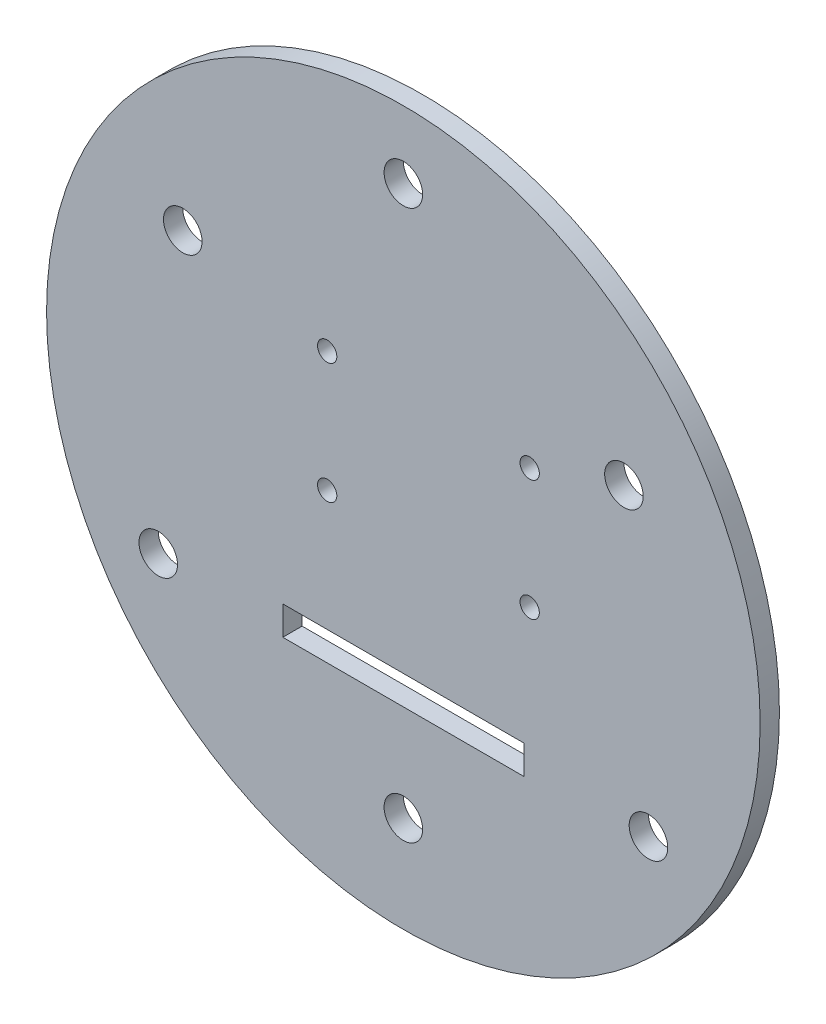
ISO-10303-21;
HEADER;
FILE_DESCRIPTION(('STEP AP214'),'2;1');
FILE_NAME('part.step','',(''),(''),'','','');
FILE_SCHEMA(('AUTOMOTIVE_DESIGN { 1 0 10303 214 1 1 1 1 }'));
ENDSEC;
DATA;
#1=APPLICATION_CONTEXT('core data for automotive mechanical design processes');
#2=APPLICATION_PROTOCOL_DEFINITION('international standard','automotive_design',2000,#1);
#3=PRODUCT_CONTEXT('',#1,'mechanical');
#4=PRODUCT('Part','Part','',(#3));
#5=PRODUCT_RELATED_PRODUCT_CATEGORY('part','',(#4));
#6=PRODUCT_DEFINITION_FORMATION('','',#4);
#7=PRODUCT_DEFINITION_CONTEXT('part definition',#1,'design');
#8=PRODUCT_DEFINITION('design','',#6,#7);
#9=PRODUCT_DEFINITION_SHAPE('','',#8);
#10=(LENGTH_UNIT() NAMED_UNIT(*) SI_UNIT(.MILLI.,.METRE.));
#11=(NAMED_UNIT(*) PLANE_ANGLE_UNIT() SI_UNIT($,.RADIAN.));
#12=(NAMED_UNIT(*) SI_UNIT($,.STERADIAN.) SOLID_ANGLE_UNIT());
#13=UNCERTAINTY_MEASURE_WITH_UNIT(LENGTH_MEASURE(1.E-05),#10,'distance_accuracy_value','');
#14=(GEOMETRIC_REPRESENTATION_CONTEXT(3) GLOBAL_UNCERTAINTY_ASSIGNED_CONTEXT((#13)) GLOBAL_UNIT_ASSIGNED_CONTEXT((#10,
#11,#12)) REPRESENTATION_CONTEXT('',''));
#15=CARTESIAN_POINT('',(0.,0.,0.));
#16=DIRECTION('',(0.,0.,1.));
#17=DIRECTION('',(1.,0.,0.));
#18=AXIS2_PLACEMENT_3D('',#15,#16,#17);
#19=CARTESIAN_POINT('',(0.,0.,2.));
#20=DIRECTION('',(0.,0.,1.));
#21=DIRECTION('',(1.,0.,0.));
#22=AXIS2_PLACEMENT_3D('',#19,#20,#21);
#23=PLANE('',#22);
#24=CARTESIAN_POINT('',(-7.9,11.,2.));
#25=DIRECTION('',(0.,0.,1.));
#26=DIRECTION('',(1.,0.,0.));
#27=AXIS2_PLACEMENT_3D('',#24,#25,#26);
#28=CIRCLE('',#27,0.999999999999999);
#29=CARTESIAN_POINT('',(-6.9,11.,2.));
#30=VERTEX_POINT('',#29);
#31=EDGE_CURVE('E41',#30,#30,#28,.T.);
#32=ORIENTED_EDGE('',*,*,#31,.F.);
#33=EDGE_LOOP('',(#32));
#34=FACE_BOUND('',#33,.T.);
#35=CARTESIAN_POINT('',(-7.9,-1.5,2.));
#36=DIRECTION('',(0.,0.,1.));
#37=DIRECTION('',(1.,0.,0.));
#38=AXIS2_PLACEMENT_3D('',#35,#36,#37);
#39=CIRCLE('',#38,1.);
#40=CARTESIAN_POINT('',(-6.9,-1.5,2.));
#41=VERTEX_POINT('',#40);
#42=EDGE_CURVE('E172',#41,#41,#39,.T.);
#43=ORIENTED_EDGE('',*,*,#42,.F.);
#44=EDGE_LOOP('',(#43));
#45=FACE_BOUND('',#44,.T.);
#46=CARTESIAN_POINT('',(13.1,-1.5,2.));
#47=DIRECTION('',(0.,0.,1.));
#48=DIRECTION('',(1.,0.,0.));
#49=AXIS2_PLACEMENT_3D('',#46,#47,#48);
#50=CIRCLE('',#49,1.);
#51=CARTESIAN_POINT('',(14.1,-1.5,2.));
#52=VERTEX_POINT('',#51);
#53=EDGE_CURVE('E170',#52,#52,#50,.T.);
#54=ORIENTED_EDGE('',*,*,#53,.F.);
#55=EDGE_LOOP('',(#54));
#56=FACE_BOUND('',#55,.T.);
#57=CARTESIAN_POINT('',(13.1,11.,2.));
#58=DIRECTION('',(0.,0.,1.));
#59=DIRECTION('',(1.,0.,0.));
#60=AXIS2_PLACEMENT_3D('',#57,#58,#59);
#61=CIRCLE('',#60,0.999999999999999);
#62=CARTESIAN_POINT('',(14.1,11.,2.));
#63=VERTEX_POINT('',#62);
#64=EDGE_CURVE('E167',#63,#63,#61,.T.);
#65=ORIENTED_EDGE('',*,*,#64,.F.);
#66=EDGE_LOOP('',(#65));
#67=FACE_BOUND('',#66,.T.);
#68=CARTESIAN_POINT('',(25.4164532094862,-15.9375,2.));
#69=DIRECTION('',(0.,0.,1.));
#70=DIRECTION('',(1.,0.,0.));
#71=AXIS2_PLACEMENT_3D('',#68,#69,#70);
#72=CIRCLE('',#71,2.);
#73=CARTESIAN_POINT('',(27.4164532094862,-15.9375,2.));
#74=VERTEX_POINT('',#73);
#75=EDGE_CURVE('E124',#74,#74,#72,.T.);
#76=ORIENTED_EDGE('',*,*,#75,.F.);
#77=EDGE_LOOP('',(#76));
#78=FACE_BOUND('',#77,.T.);
#79=CARTESIAN_POINT('',(-25.4164532094862,-15.9375,2.));
#80=DIRECTION('',(0.,0.,1.));
#81=DIRECTION('',(1.,0.,0.));
#82=AXIS2_PLACEMENT_3D('',#79,#80,#81);
#83=CIRCLE('',#82,2.);
#84=CARTESIAN_POINT('',(-23.4164532094862,-15.9375,2.));
#85=VERTEX_POINT('',#84);
#86=EDGE_CURVE('E136',#85,#85,#83,.T.);
#87=ORIENTED_EDGE('',*,*,#86,.F.);
#88=EDGE_LOOP('',(#87));
#89=FACE_BOUND('',#88,.T.);
#90=CARTESIAN_POINT('',(0.,30.,2.));
#91=DIRECTION('',(0.,0.,1.));
#92=DIRECTION('',(1.,0.,0.));
#93=AXIS2_PLACEMENT_3D('',#90,#91,#92);
#94=CIRCLE('',#93,2.);
#95=CARTESIAN_POINT('',(2.,30.,2.));
#96=VERTEX_POINT('',#95);
#97=EDGE_CURVE('E148',#96,#96,#94,.T.);
#98=ORIENTED_EDGE('',*,*,#97,.F.);
#99=EDGE_LOOP('',(#98));
#100=FACE_BOUND('',#99,.T.);
#101=CARTESIAN_POINT('',(0.,0.,2.));
#102=DIRECTION('',(0.,0.,1.));
#103=DIRECTION('',(1.,0.,0.));
#104=AXIS2_PLACEMENT_3D('',#101,#102,#103);
#105=CIRCLE('',#104,37.);
#106=CARTESIAN_POINT('',(37.,0.,2.));
#107=VERTEX_POINT('',#106);
#108=EDGE_CURVE('E154',#107,#107,#105,.T.);
#109=ORIENTED_EDGE('',*,*,#108,.T.);
#110=EDGE_LOOP('',(#109));
#111=FACE_BOUND('',#110,.T.);
#112=CARTESIAN_POINT('',(-22.8748078885376,14.34375,2.));
#113=DIRECTION('',(0.,0.,1.));
#114=DIRECTION('',(1.,0.,0.));
#115=AXIS2_PLACEMENT_3D('',#112,#113,#114);
#116=CIRCLE('',#115,2.);
#117=CARTESIAN_POINT('',(-20.8748078885376,14.34375,2.));
#118=VERTEX_POINT('',#117);
#119=EDGE_CURVE('E142',#118,#118,#116,.T.);
#120=ORIENTED_EDGE('',*,*,#119,.F.);
#121=EDGE_LOOP('',(#120));
#122=FACE_BOUND('',#121,.T.);
#123=CARTESIAN_POINT('',(0.,-27.,2.));
#124=DIRECTION('',(0.,0.,1.));
#125=DIRECTION('',(1.,0.,0.));
#126=AXIS2_PLACEMENT_3D('',#123,#124,#125);
#127=CIRCLE('',#126,2.);
#128=CARTESIAN_POINT('',(2.,-27.,2.));
#129=VERTEX_POINT('',#128);
#130=EDGE_CURVE('E130',#129,#129,#127,.T.);
#131=ORIENTED_EDGE('',*,*,#130,.F.);
#132=EDGE_LOOP('',(#131));
#133=FACE_BOUND('',#132,.T.);
#134=CARTESIAN_POINT('',(22.8748078885376,14.34375,2.));
#135=DIRECTION('',(0.,0.,1.));
#136=DIRECTION('',(1.,0.,0.));
#137=AXIS2_PLACEMENT_3D('',#134,#135,#136);
#138=CIRCLE('',#137,2.);
#139=CARTESIAN_POINT('',(24.8748078885376,14.34375,2.));
#140=VERTEX_POINT('',#139);
#141=EDGE_CURVE('E118',#140,#140,#138,.T.);
#142=ORIENTED_EDGE('',*,*,#141,.F.);
#143=EDGE_LOOP('',(#142));
#144=FACE_BOUND('',#143,.T.);
#145=DIRECTION('',(-1.,0.,0.));
#146=VECTOR('',#145,1.);
#147=CARTESIAN_POINT('',(12.5,-14.,2.));
#148=LINE('',#147,#146);
#149=CARTESIAN_POINT('',(12.5,-14.,2.));
#150=VERTEX_POINT('',#149);
#151=CARTESIAN_POINT('',(-12.5,-14.,2.));
#152=VERTEX_POINT('',#151);
#153=EDGE_CURVE('E88',#150,#152,#148,.T.);
#154=ORIENTED_EDGE('',*,*,#153,.F.);
#155=DIRECTION('',(0.,1.,0.));
#156=VECTOR('',#155,1.);
#157=CARTESIAN_POINT('',(12.5,-14.,2.));
#158=LINE('',#157,#156);
#159=CARTESIAN_POINT('',(12.5,-17.,2.));
#160=VERTEX_POINT('',#159);
#161=EDGE_CURVE('E80',#160,#150,#158,.T.);
#162=ORIENTED_EDGE('',*,*,#161,.F.);
#163=DIRECTION('',(1.,0.,0.));
#164=VECTOR('',#163,1.);
#165=CARTESIAN_POINT('',(12.5,-17.,2.));
#166=LINE('',#165,#164);
#167=CARTESIAN_POINT('',(-12.5,-17.,2.));
#168=VERTEX_POINT('',#167);
#169=EDGE_CURVE('E102',#168,#160,#166,.T.);
#170=ORIENTED_EDGE('',*,*,#169,.F.);
#171=DIRECTION('',(0.,-1.,0.));
#172=VECTOR('',#171,1.);
#173=CARTESIAN_POINT('',(-12.5,-14.,2.));
#174=LINE('',#173,#172);
#175=EDGE_CURVE('E100',#152,#168,#174,.T.);
#176=ORIENTED_EDGE('',*,*,#175,.F.);
#177=EDGE_LOOP('',(#154,#162,#170,#176));
#178=FACE_BOUND('',#177,.T.);
#179=ADVANCED_FACE('F37',(#34,#45,#56,#67,#78,#89,#100,#111,#122,#133,#144,#178),#23,.T.);
#180=CARTESIAN_POINT('',(0.,0.,0.));
#181=DIRECTION('',(0.,0.,1.));
#182=DIRECTION('',(1.,0.,0.));
#183=AXIS2_PLACEMENT_3D('',#180,#181,#182);
#184=PLANE('',#183);
#185=CARTESIAN_POINT('',(13.1,-1.5,0.));
#186=DIRECTION('',(0.,0.,1.));
#187=DIRECTION('',(1.,0.,0.));
#188=AXIS2_PLACEMENT_3D('',#185,#186,#187);
#189=CIRCLE('',#188,1.75);
#190=CARTESIAN_POINT('',(14.85,-1.5,0.));
#191=VERTEX_POINT('',#190);
#192=EDGE_CURVE('E11',#191,#191,#189,.F.);
#193=ORIENTED_EDGE('',*,*,#192,.F.);
#194=EDGE_LOOP('',(#193));
#195=FACE_BOUND('',#194,.T.);
#196=CARTESIAN_POINT('',(13.1,11.,0.));
#197=DIRECTION('',(0.,0.,1.));
#198=DIRECTION('',(1.,0.,0.));
#199=AXIS2_PLACEMENT_3D('',#196,#197,#198);
#200=CIRCLE('',#199,1.75);
#201=CARTESIAN_POINT('',(14.85,11.,0.));
#202=VERTEX_POINT('',#201);
#203=EDGE_CURVE('E46',#202,#202,#200,.F.);
#204=ORIENTED_EDGE('',*,*,#203,.F.);
#205=EDGE_LOOP('',(#204));
#206=FACE_BOUND('',#205,.T.);
#207=CARTESIAN_POINT('',(-7.9,11.,0.));
#208=DIRECTION('',(0.,0.,1.));
#209=DIRECTION('',(1.,0.,0.));
#210=AXIS2_PLACEMENT_3D('',#207,#208,#209);
#211=CIRCLE('',#210,1.75);
#212=CARTESIAN_POINT('',(-6.15,11.,0.));
#213=VERTEX_POINT('',#212);
#214=EDGE_CURVE('E162',#213,#213,#211,.F.);
#215=ORIENTED_EDGE('',*,*,#214,.F.);
#216=EDGE_LOOP('',(#215));
#217=FACE_BOUND('',#216,.T.);
#218=CARTESIAN_POINT('',(-7.9,-1.5,0.));
#219=DIRECTION('',(0.,0.,1.));
#220=DIRECTION('',(1.,0.,0.));
#221=AXIS2_PLACEMENT_3D('',#218,#219,#220);
#222=CIRCLE('',#221,1.75);
#223=CARTESIAN_POINT('',(-6.15,-1.5,0.));
#224=VERTEX_POINT('',#223);
#225=EDGE_CURVE('E157',#224,#224,#222,.F.);
#226=ORIENTED_EDGE('',*,*,#225,.F.);
#227=EDGE_LOOP('',(#226));
#228=FACE_BOUND('',#227,.T.);
#229=CARTESIAN_POINT('',(22.8748078885376,14.34375,0.));
#230=DIRECTION('',(0.,0.,1.));
#231=DIRECTION('',(1.,0.,0.));
#232=AXIS2_PLACEMENT_3D('',#229,#230,#231);
#233=CIRCLE('',#232,2.);
#234=CARTESIAN_POINT('',(24.8748078885376,14.34375,0.));
#235=VERTEX_POINT('',#234);
#236=EDGE_CURVE('E96',#235,#235,#233,.T.);
#237=ORIENTED_EDGE('',*,*,#236,.T.);
#238=EDGE_LOOP('',(#237));
#239=FACE_BOUND('',#238,.T.);
#240=CARTESIAN_POINT('',(25.4164532094862,-15.9375,0.));
#241=DIRECTION('',(0.,0.,1.));
#242=DIRECTION('',(1.,0.,0.));
#243=AXIS2_PLACEMENT_3D('',#240,#241,#242);
#244=CIRCLE('',#243,2.);
#245=CARTESIAN_POINT('',(27.4164532094862,-15.9375,0.));
#246=VERTEX_POINT('',#245);
#247=EDGE_CURVE('E121',#246,#246,#244,.T.);
#248=ORIENTED_EDGE('',*,*,#247,.T.);
#249=EDGE_LOOP('',(#248));
#250=FACE_BOUND('',#249,.T.);
#251=CARTESIAN_POINT('',(0.,-27.,0.));
#252=DIRECTION('',(0.,0.,1.));
#253=DIRECTION('',(1.,0.,0.));
#254=AXIS2_PLACEMENT_3D('',#251,#252,#253);
#255=CIRCLE('',#254,2.);
#256=CARTESIAN_POINT('',(2.,-27.,0.));
#257=VERTEX_POINT('',#256);
#258=EDGE_CURVE('E127',#257,#257,#255,.T.);
#259=ORIENTED_EDGE('',*,*,#258,.T.);
#260=EDGE_LOOP('',(#259));
#261=FACE_BOUND('',#260,.T.);
#262=CARTESIAN_POINT('',(-25.4164532094862,-15.9375,0.));
#263=DIRECTION('',(0.,0.,1.));
#264=DIRECTION('',(1.,0.,0.));
#265=AXIS2_PLACEMENT_3D('',#262,#263,#264);
#266=CIRCLE('',#265,2.);
#267=CARTESIAN_POINT('',(-23.4164532094862,-15.9375,0.));
#268=VERTEX_POINT('',#267);
#269=EDGE_CURVE('E133',#268,#268,#266,.T.);
#270=ORIENTED_EDGE('',*,*,#269,.T.);
#271=EDGE_LOOP('',(#270));
#272=FACE_BOUND('',#271,.T.);
#273=CARTESIAN_POINT('',(-22.8748078885376,14.34375,0.));
#274=DIRECTION('',(0.,0.,1.));
#275=DIRECTION('',(1.,0.,0.));
#276=AXIS2_PLACEMENT_3D('',#273,#274,#275);
#277=CIRCLE('',#276,2.);
#278=CARTESIAN_POINT('',(-20.8748078885376,14.34375,0.));
#279=VERTEX_POINT('',#278);
#280=EDGE_CURVE('E139',#279,#279,#277,.T.);
#281=ORIENTED_EDGE('',*,*,#280,.T.);
#282=EDGE_LOOP('',(#281));
#283=FACE_BOUND('',#282,.T.);
#284=CARTESIAN_POINT('',(0.,30.,0.));
#285=DIRECTION('',(0.,0.,1.));
#286=DIRECTION('',(1.,0.,0.));
#287=AXIS2_PLACEMENT_3D('',#284,#285,#286);
#288=CIRCLE('',#287,2.);
#289=CARTESIAN_POINT('',(2.,30.,0.));
#290=VERTEX_POINT('',#289);
#291=EDGE_CURVE('E145',#290,#290,#288,.T.);
#292=ORIENTED_EDGE('',*,*,#291,.T.);
#293=EDGE_LOOP('',(#292));
#294=FACE_BOUND('',#293,.T.);
#295=CARTESIAN_POINT('',(0.,0.,0.));
#296=DIRECTION('',(0.,0.,1.));
#297=DIRECTION('',(1.,0.,0.));
#298=AXIS2_PLACEMENT_3D('',#295,#296,#297);
#299=CIRCLE('',#298,37.);
#300=CARTESIAN_POINT('',(37.,0.,0.));
#301=VERTEX_POINT('',#300);
#302=EDGE_CURVE('E151',#301,#301,#299,.T.);
#303=ORIENTED_EDGE('',*,*,#302,.F.);
#304=EDGE_LOOP('',(#303));
#305=FACE_BOUND('',#304,.T.);
#306=DIRECTION('',(0.,1.,0.));
#307=VECTOR('',#306,1.);
#308=CARTESIAN_POINT('',(12.5,-14.,0.));
#309=LINE('',#308,#307);
#310=CARTESIAN_POINT('',(12.5,-17.,0.));
#311=VERTEX_POINT('',#310);
#312=CARTESIAN_POINT('',(12.5,-14.,0.));
#313=VERTEX_POINT('',#312);
#314=EDGE_CURVE('E62',#311,#313,#309,.T.);
#315=ORIENTED_EDGE('',*,*,#314,.T.);
#316=DIRECTION('',(-1.,0.,0.));
#317=VECTOR('',#316,1.);
#318=CARTESIAN_POINT('',(12.5,-14.,0.));
#319=LINE('',#318,#317);
#320=CARTESIAN_POINT('',(-12.5,-14.,0.));
#321=VERTEX_POINT('',#320);
#322=EDGE_CURVE('E95',#313,#321,#319,.T.);
#323=ORIENTED_EDGE('',*,*,#322,.T.);
#324=DIRECTION('',(0.,-1.,0.));
#325=VECTOR('',#324,1.);
#326=CARTESIAN_POINT('',(-12.5,-14.,0.));
#327=LINE('',#326,#325);
#328=CARTESIAN_POINT('',(-12.5,-17.,0.));
#329=VERTEX_POINT('',#328);
#330=EDGE_CURVE('E110',#321,#329,#327,.T.);
#331=ORIENTED_EDGE('',*,*,#330,.T.);
#332=DIRECTION('',(1.,0.,0.));
#333=VECTOR('',#332,1.);
#334=CARTESIAN_POINT('',(12.5,-17.,0.));
#335=LINE('',#334,#333);
#336=EDGE_CURVE('E89',#329,#311,#335,.T.);
#337=ORIENTED_EDGE('',*,*,#336,.T.);
#338=EDGE_LOOP('',(#315,#323,#331,#337));
#339=FACE_BOUND('',#338,.T.);
#340=ADVANCED_FACE('F214',(#195,#206,#217,#228,#239,#250,#261,#272,#283,#294,#305,#339),#184,.F.);
#341=CARTESIAN_POINT('',(0.,0.,2.));
#342=DIRECTION('',(0.,0.,-1.));
#343=DIRECTION('',(-1.,0.,0.));
#344=AXIS2_PLACEMENT_3D('',#341,#342,#343);
#345=CYLINDRICAL_SURFACE('',#344,37.);
#346=ORIENTED_EDGE('',*,*,#108,.F.);
#347=EDGE_LOOP('',(#346));
#348=FACE_BOUND('',#347,.T.);
#349=ORIENTED_EDGE('',*,*,#302,.T.);
#350=EDGE_LOOP('',(#349));
#351=FACE_BOUND('',#350,.T.);
#352=ADVANCED_FACE('F39',(#348,#351),#345,.T.);
#353=CARTESIAN_POINT('',(0.,30.,2.));
#354=DIRECTION('',(0.,0.,-1.));
#355=DIRECTION('',(-1.,0.,0.));
#356=AXIS2_PLACEMENT_3D('',#353,#354,#355);
#357=CYLINDRICAL_SURFACE('',#356,2.);
#358=ORIENTED_EDGE('',*,*,#97,.T.);
#359=EDGE_LOOP('',(#358));
#360=FACE_BOUND('',#359,.T.);
#361=ORIENTED_EDGE('',*,*,#291,.F.);
#362=EDGE_LOOP('',(#361));
#363=FACE_BOUND('',#362,.T.);
#364=ADVANCED_FACE('F252',(#360,#363),#357,.F.);
#365=CARTESIAN_POINT('',(-22.8748078885376,14.34375,2.));
#366=DIRECTION('',(0.,0.,-1.));
#367=DIRECTION('',(-1.,0.,0.));
#368=AXIS2_PLACEMENT_3D('',#365,#366,#367);
#369=CYLINDRICAL_SURFACE('',#368,2.);
#370=ORIENTED_EDGE('',*,*,#119,.T.);
#371=EDGE_LOOP('',(#370));
#372=FACE_BOUND('',#371,.T.);
#373=ORIENTED_EDGE('',*,*,#280,.F.);
#374=EDGE_LOOP('',(#373));
#375=FACE_BOUND('',#374,.T.);
#376=ADVANCED_FACE('F255',(#372,#375),#369,.F.);
#377=CARTESIAN_POINT('',(-25.4164532094862,-15.9375,2.));
#378=DIRECTION('',(0.,0.,-1.));
#379=DIRECTION('',(-1.,0.,0.));
#380=AXIS2_PLACEMENT_3D('',#377,#378,#379);
#381=CYLINDRICAL_SURFACE('',#380,2.);
#382=ORIENTED_EDGE('',*,*,#86,.T.);
#383=EDGE_LOOP('',(#382));
#384=FACE_BOUND('',#383,.T.);
#385=ORIENTED_EDGE('',*,*,#269,.F.);
#386=EDGE_LOOP('',(#385));
#387=FACE_BOUND('',#386,.T.);
#388=ADVANCED_FACE('F259',(#384,#387),#381,.F.);
#389=CARTESIAN_POINT('',(0.,-27.,2.));
#390=DIRECTION('',(0.,0.,-1.));
#391=DIRECTION('',(-1.,0.,0.));
#392=AXIS2_PLACEMENT_3D('',#389,#390,#391);
#393=CYLINDRICAL_SURFACE('',#392,2.);
#394=ORIENTED_EDGE('',*,*,#130,.T.);
#395=EDGE_LOOP('',(#394));
#396=FACE_BOUND('',#395,.T.);
#397=ORIENTED_EDGE('',*,*,#258,.F.);
#398=EDGE_LOOP('',(#397));
#399=FACE_BOUND('',#398,.T.);
#400=ADVANCED_FACE('F263',(#396,#399),#393,.F.);
#401=CARTESIAN_POINT('',(25.4164532094862,-15.9375,2.));
#402=DIRECTION('',(0.,0.,-1.));
#403=DIRECTION('',(-1.,0.,0.));
#404=AXIS2_PLACEMENT_3D('',#401,#402,#403);
#405=CYLINDRICAL_SURFACE('',#404,2.);
#406=ORIENTED_EDGE('',*,*,#75,.T.);
#407=EDGE_LOOP('',(#406));
#408=FACE_BOUND('',#407,.T.);
#409=ORIENTED_EDGE('',*,*,#247,.F.);
#410=EDGE_LOOP('',(#409));
#411=FACE_BOUND('',#410,.T.);
#412=ADVANCED_FACE('F267',(#408,#411),#405,.F.);
#413=CARTESIAN_POINT('',(22.8748078885376,14.34375,2.));
#414=DIRECTION('',(0.,0.,-1.));
#415=DIRECTION('',(-1.,0.,0.));
#416=AXIS2_PLACEMENT_3D('',#413,#414,#415);
#417=CYLINDRICAL_SURFACE('',#416,2.);
#418=ORIENTED_EDGE('',*,*,#141,.T.);
#419=EDGE_LOOP('',(#418));
#420=FACE_BOUND('',#419,.T.);
#421=ORIENTED_EDGE('',*,*,#236,.F.);
#422=EDGE_LOOP('',(#421));
#423=FACE_BOUND('',#422,.T.);
#424=ADVANCED_FACE('F271',(#420,#423),#417,.F.);
#425=CARTESIAN_POINT('',(12.5,-14.,2.));
#426=DIRECTION('',(-1.,0.,0.));
#427=DIRECTION('',(0.,0.,1.));
#428=AXIS2_PLACEMENT_3D('',#425,#426,#427);
#429=PLANE('',#428);
#430=ORIENTED_EDGE('',*,*,#314,.F.);
#431=DIRECTION('',(0.,0.,-1.));
#432=VECTOR('',#431,1.);
#433=CARTESIAN_POINT('',(12.5,-17.,2.));
#434=LINE('',#433,#432);
#435=EDGE_CURVE('E84',#160,#311,#434,.T.);
#436=ORIENTED_EDGE('',*,*,#435,.F.);
#437=ORIENTED_EDGE('',*,*,#161,.T.);
#438=DIRECTION('',(0.,0.,-1.));
#439=VECTOR('',#438,1.);
#440=CARTESIAN_POINT('',(12.5,-14.,2.));
#441=LINE('',#440,#439);
#442=EDGE_CURVE('E83',#150,#313,#441,.T.);
#443=ORIENTED_EDGE('',*,*,#442,.T.);
#444=EDGE_LOOP('',(#430,#436,#437,#443));
#445=FACE_BOUND('',#444,.T.);
#446=ADVANCED_FACE('F82',(#445),#429,.T.);
#447=CARTESIAN_POINT('',(12.5,-14.,2.));
#448=DIRECTION('',(0.,-1.,0.));
#449=DIRECTION('',(1.,0.,0.));
#450=AXIS2_PLACEMENT_3D('',#447,#448,#449);
#451=PLANE('',#450);
#452=ORIENTED_EDGE('',*,*,#322,.F.);
#453=ORIENTED_EDGE('',*,*,#442,.F.);
#454=ORIENTED_EDGE('',*,*,#153,.T.);
#455=DIRECTION('',(0.,0.,-1.));
#456=VECTOR('',#455,1.);
#457=CARTESIAN_POINT('',(-12.5,-14.,2.));
#458=LINE('',#457,#456);
#459=EDGE_CURVE('E97',#152,#321,#458,.T.);
#460=ORIENTED_EDGE('',*,*,#459,.T.);
#461=EDGE_LOOP('',(#452,#453,#454,#460));
#462=FACE_BOUND('',#461,.T.);
#463=ADVANCED_FACE('F92',(#462),#451,.T.);
#464=CARTESIAN_POINT('',(-12.5,-14.,2.));
#465=DIRECTION('',(1.,0.,0.));
#466=DIRECTION('',(0.,0.,-1.));
#467=AXIS2_PLACEMENT_3D('',#464,#465,#466);
#468=PLANE('',#467);
#469=ORIENTED_EDGE('',*,*,#330,.F.);
#470=ORIENTED_EDGE('',*,*,#459,.F.);
#471=ORIENTED_EDGE('',*,*,#175,.T.);
#472=DIRECTION('',(0.,0.,-1.));
#473=VECTOR('',#472,1.);
#474=CARTESIAN_POINT('',(-12.5,-17.,2.));
#475=LINE('',#474,#473);
#476=EDGE_CURVE('E54',#168,#329,#475,.T.);
#477=ORIENTED_EDGE('',*,*,#476,.T.);
#478=EDGE_LOOP('',(#469,#470,#471,#477));
#479=FACE_BOUND('',#478,.T.);
#480=ADVANCED_FACE('F235',(#479),#468,.T.);
#481=CARTESIAN_POINT('',(12.5,-17.,2.));
#482=DIRECTION('',(0.,1.,0.));
#483=DIRECTION('',(-1.,0.,0.));
#484=AXIS2_PLACEMENT_3D('',#481,#482,#483);
#485=PLANE('',#484);
#486=ORIENTED_EDGE('',*,*,#336,.F.);
#487=ORIENTED_EDGE('',*,*,#476,.F.);
#488=ORIENTED_EDGE('',*,*,#169,.T.);
#489=ORIENTED_EDGE('',*,*,#435,.T.);
#490=EDGE_LOOP('',(#486,#487,#488,#489));
#491=FACE_BOUND('',#490,.T.);
#492=ADVANCED_FACE('F233',(#491),#485,.T.);
#493=CARTESIAN_POINT('',(-7.9,-1.5,-10.));
#494=DIRECTION('',(0.,0.,1.));
#495=DIRECTION('',(1.,0.,0.));
#496=AXIS2_PLACEMENT_3D('',#493,#494,#495);
#497=CYLINDRICAL_SURFACE('',#496,1.);
#498=CARTESIAN_POINT('',(-7.9,-1.5,-10.));
#499=DIRECTION('',(0.,0.,-1.));
#500=DIRECTION('',(-1.,0.,0.));
#501=AXIS2_PLACEMENT_3D('',#498,#499,#500);
#502=CIRCLE('',#501,1.);
#503=CARTESIAN_POINT('',(-8.9,-1.5,-10.));
#504=VERTEX_POINT('',#503);
#505=EDGE_CURVE('E200',#504,#504,#502,.T.);
#506=ORIENTED_EDGE('',*,*,#505,.T.);
#507=EDGE_LOOP('',(#506));
#508=FACE_BOUND('',#507,.T.);
#509=ORIENTED_EDGE('',*,*,#42,.T.);
#510=EDGE_LOOP('',(#509));
#511=FACE_BOUND('',#510,.T.);
#512=ADVANCED_FACE('F210',(#508,#511),#497,.F.);
#513=CARTESIAN_POINT('',(-7.9,-1.5,-10.));
#514=DIRECTION('',(0.,0.,1.));
#515=DIRECTION('',(1.,0.,0.));
#516=AXIS2_PLACEMENT_3D('',#513,#514,#515);
#517=CYLINDRICAL_SURFACE('',#516,1.75);
#518=CARTESIAN_POINT('',(-7.9,-1.5,-10.));
#519=DIRECTION('',(0.,0.,-1.));
#520=DIRECTION('',(-1.,0.,0.));
#521=AXIS2_PLACEMENT_3D('',#518,#519,#520);
#522=CIRCLE('',#521,1.75);
#523=CARTESIAN_POINT('',(-9.65,-1.5,-10.));
#524=VERTEX_POINT('',#523);
#525=EDGE_CURVE('E108',#524,#524,#522,.T.);
#526=ORIENTED_EDGE('',*,*,#525,.F.);
#527=EDGE_LOOP('',(#526));
#528=FACE_BOUND('',#527,.T.);
#529=ORIENTED_EDGE('',*,*,#225,.T.);
#530=EDGE_LOOP('',(#529));
#531=FACE_BOUND('',#530,.T.);
#532=ADVANCED_FACE('F207',(#528,#531),#517,.T.);
#533=CARTESIAN_POINT('',(0.,0.,-10.));
#534=DIRECTION('',(0.,0.,-1.));
#535=DIRECTION('',(-1.,0.,0.));
#536=AXIS2_PLACEMENT_3D('',#533,#534,#535);
#537=PLANE('',#536);
#538=ORIENTED_EDGE('',*,*,#505,.F.);
#539=EDGE_LOOP('',(#538));
#540=FACE_BOUND('',#539,.T.);
#541=ORIENTED_EDGE('',*,*,#525,.T.);
#542=EDGE_LOOP('',(#541));
#543=FACE_BOUND('',#542,.T.);
#544=ADVANCED_FACE('F205',(#540,#543),#537,.T.);
#545=CARTESIAN_POINT('',(-7.9,11.,-10.));
#546=DIRECTION('',(0.,0.,1.));
#547=DIRECTION('',(1.,0.,0.));
#548=AXIS2_PLACEMENT_3D('',#545,#546,#547);
#549=CYLINDRICAL_SURFACE('',#548,0.999999999999999);
#550=CARTESIAN_POINT('',(-7.9,11.,-10.));
#551=DIRECTION('',(0.,0.,-1.));
#552=DIRECTION('',(-1.,0.,0.));
#553=AXIS2_PLACEMENT_3D('',#550,#551,#552);
#554=CIRCLE('',#553,0.999999999999999);
#555=CARTESIAN_POINT('',(-8.9,11.,-10.));
#556=VERTEX_POINT('',#555);
#557=EDGE_CURVE('E194',#556,#556,#554,.T.);
#558=ORIENTED_EDGE('',*,*,#557,.T.);
#559=EDGE_LOOP('',(#558));
#560=FACE_BOUND('',#559,.T.);
#561=ORIENTED_EDGE('',*,*,#31,.T.);
#562=EDGE_LOOP('',(#561));
#563=FACE_BOUND('',#562,.T.);
#564=ADVANCED_FACE('F315',(#560,#563),#549,.F.);
#565=CARTESIAN_POINT('',(-7.9,11.,-10.));
#566=DIRECTION('',(0.,0.,1.));
#567=DIRECTION('',(1.,0.,0.));
#568=AXIS2_PLACEMENT_3D('',#565,#566,#567);
#569=CYLINDRICAL_SURFACE('',#568,1.75);
#570=CARTESIAN_POINT('',(-7.9,11.,-10.));
#571=DIRECTION('',(0.,0.,-1.));
#572=DIRECTION('',(-1.,0.,0.));
#573=AXIS2_PLACEMENT_3D('',#570,#571,#572);
#574=CIRCLE('',#573,1.75);
#575=CARTESIAN_POINT('',(-9.65,11.,-10.));
#576=VERTEX_POINT('',#575);
#577=EDGE_CURVE('E197',#576,#576,#574,.T.);
#578=ORIENTED_EDGE('',*,*,#577,.F.);
#579=EDGE_LOOP('',(#578));
#580=FACE_BOUND('',#579,.T.);
#581=ORIENTED_EDGE('',*,*,#214,.T.);
#582=EDGE_LOOP('',(#581));
#583=FACE_BOUND('',#582,.T.);
#584=ADVANCED_FACE('F323',(#580,#583),#569,.T.);
#585=CARTESIAN_POINT('',(0.,0.,-10.));
#586=DIRECTION('',(0.,0.,-1.));
#587=DIRECTION('',(-1.,0.,0.));
#588=AXIS2_PLACEMENT_3D('',#585,#586,#587);
#589=PLANE('',#588);
#590=ORIENTED_EDGE('',*,*,#557,.F.);
#591=EDGE_LOOP('',(#590));
#592=FACE_BOUND('',#591,.T.);
#593=ORIENTED_EDGE('',*,*,#577,.T.);
#594=EDGE_LOOP('',(#593));
#595=FACE_BOUND('',#594,.T.);
#596=ADVANCED_FACE('F328',(#592,#595),#589,.T.);
#597=CARTESIAN_POINT('',(13.1,11.,-10.));
#598=DIRECTION('',(0.,0.,1.));
#599=DIRECTION('',(1.,0.,0.));
#600=AXIS2_PLACEMENT_3D('',#597,#598,#599);
#601=CYLINDRICAL_SURFACE('',#600,0.999999999999999);
#602=CARTESIAN_POINT('',(13.1,11.,-10.));
#603=DIRECTION('',(0.,0.,-1.));
#604=DIRECTION('',(-1.,0.,0.));
#605=AXIS2_PLACEMENT_3D('',#602,#603,#604);
#606=CIRCLE('',#605,0.999999999999999);
#607=CARTESIAN_POINT('',(12.1,11.,-10.));
#608=VERTEX_POINT('',#607);
#609=EDGE_CURVE('E186',#608,#608,#606,.T.);
#610=ORIENTED_EDGE('',*,*,#609,.T.);
#611=EDGE_LOOP('',(#610));
#612=FACE_BOUND('',#611,.T.);
#613=ORIENTED_EDGE('',*,*,#64,.T.);
#614=EDGE_LOOP('',(#613));
#615=FACE_BOUND('',#614,.T.);
#616=ADVANCED_FACE('F338',(#612,#615),#601,.F.);
#617=CARTESIAN_POINT('',(13.1,11.,-10.));
#618=DIRECTION('',(0.,0.,1.));
#619=DIRECTION('',(1.,0.,0.));
#620=AXIS2_PLACEMENT_3D('',#617,#618,#619);
#621=CYLINDRICAL_SURFACE('',#620,1.75);
#622=CARTESIAN_POINT('',(13.1,11.,-10.));
#623=DIRECTION('',(0.,0.,-1.));
#624=DIRECTION('',(-1.,0.,0.));
#625=AXIS2_PLACEMENT_3D('',#622,#623,#624);
#626=CIRCLE('',#625,1.75);
#627=CARTESIAN_POINT('',(11.35,11.,-10.));
#628=VERTEX_POINT('',#627);
#629=EDGE_CURVE('E191',#628,#628,#626,.T.);
#630=ORIENTED_EDGE('',*,*,#629,.F.);
#631=EDGE_LOOP('',(#630));
#632=FACE_BOUND('',#631,.T.);
#633=ORIENTED_EDGE('',*,*,#203,.T.);
#634=EDGE_LOOP('',(#633));
#635=FACE_BOUND('',#634,.T.);
#636=ADVANCED_FACE('F346',(#632,#635),#621,.T.);
#637=CARTESIAN_POINT('',(0.,0.,-10.));
#638=DIRECTION('',(0.,0.,-1.));
#639=DIRECTION('',(-1.,0.,0.));
#640=AXIS2_PLACEMENT_3D('',#637,#638,#639);
#641=PLANE('',#640);
#642=ORIENTED_EDGE('',*,*,#609,.F.);
#643=EDGE_LOOP('',(#642));
#644=FACE_BOUND('',#643,.T.);
#645=ORIENTED_EDGE('',*,*,#629,.T.);
#646=EDGE_LOOP('',(#645));
#647=FACE_BOUND('',#646,.T.);
#648=ADVANCED_FACE('F351',(#644,#647),#641,.T.);
#649=CARTESIAN_POINT('',(13.1,-1.5,-10.));
#650=DIRECTION('',(0.,0.,1.));
#651=DIRECTION('',(1.,0.,0.));
#652=AXIS2_PLACEMENT_3D('',#649,#650,#651);
#653=CYLINDRICAL_SURFACE('',#652,1.);
#654=CARTESIAN_POINT('',(13.1,-1.5,-10.));
#655=DIRECTION('',(0.,0.,-1.));
#656=DIRECTION('',(-1.,0.,0.));
#657=AXIS2_PLACEMENT_3D('',#654,#655,#656);
#658=CIRCLE('',#657,1.);
#659=CARTESIAN_POINT('',(12.1,-1.5,-10.));
#660=VERTEX_POINT('',#659);
#661=EDGE_CURVE('E177',#660,#660,#658,.T.);
#662=ORIENTED_EDGE('',*,*,#661,.T.);
#663=EDGE_LOOP('',(#662));
#664=FACE_BOUND('',#663,.T.);
#665=ORIENTED_EDGE('',*,*,#53,.T.);
#666=EDGE_LOOP('',(#665));
#667=FACE_BOUND('',#666,.T.);
#668=ADVANCED_FACE('F361',(#664,#667),#653,.F.);
#669=CARTESIAN_POINT('',(13.1,-1.5,-10.));
#670=DIRECTION('',(0.,0.,1.));
#671=DIRECTION('',(1.,0.,0.));
#672=AXIS2_PLACEMENT_3D('',#669,#670,#671);
#673=CYLINDRICAL_SURFACE('',#672,1.75);
#674=CARTESIAN_POINT('',(13.1,-1.5,-10.));
#675=DIRECTION('',(0.,0.,-1.));
#676=DIRECTION('',(-1.,0.,0.));
#677=AXIS2_PLACEMENT_3D('',#674,#675,#676);
#678=CIRCLE('',#677,1.75);
#679=CARTESIAN_POINT('',(11.35,-1.5,-10.));
#680=VERTEX_POINT('',#679);
#681=EDGE_CURVE('E181',#680,#680,#678,.T.);
#682=ORIENTED_EDGE('',*,*,#681,.F.);
#683=EDGE_LOOP('',(#682));
#684=FACE_BOUND('',#683,.T.);
#685=ORIENTED_EDGE('',*,*,#192,.T.);
#686=EDGE_LOOP('',(#685));
#687=FACE_BOUND('',#686,.T.);
#688=ADVANCED_FACE('F369',(#684,#687),#673,.T.);
#689=CARTESIAN_POINT('',(0.,0.,-10.));
#690=DIRECTION('',(0.,0.,-1.));
#691=DIRECTION('',(-1.,0.,0.));
#692=AXIS2_PLACEMENT_3D('',#689,#690,#691);
#693=PLANE('',#692);
#694=ORIENTED_EDGE('',*,*,#661,.F.);
#695=EDGE_LOOP('',(#694));
#696=FACE_BOUND('',#695,.T.);
#697=ORIENTED_EDGE('',*,*,#681,.T.);
#698=EDGE_LOOP('',(#697));
#699=FACE_BOUND('',#698,.T.);
#700=ADVANCED_FACE('F374',(#696,#699),#693,.T.);
#701=CLOSED_SHELL('',(#179,#340,#352,#364,#376,#388,#400,#412,#424,#446,#463,#480,#492,#512,
#532,#544,#564,#584,#596,#616,#636,#648,#668,#688,#700));
#702=MANIFOLD_SOLID_BREP('B2',#701);
#703=ADVANCED_BREP_SHAPE_REPRESENTATION('',(#18,#702),#14);
#704=SHAPE_DEFINITION_REPRESENTATION(#9,#703);
ENDSEC;
END-ISO-10303-21;
